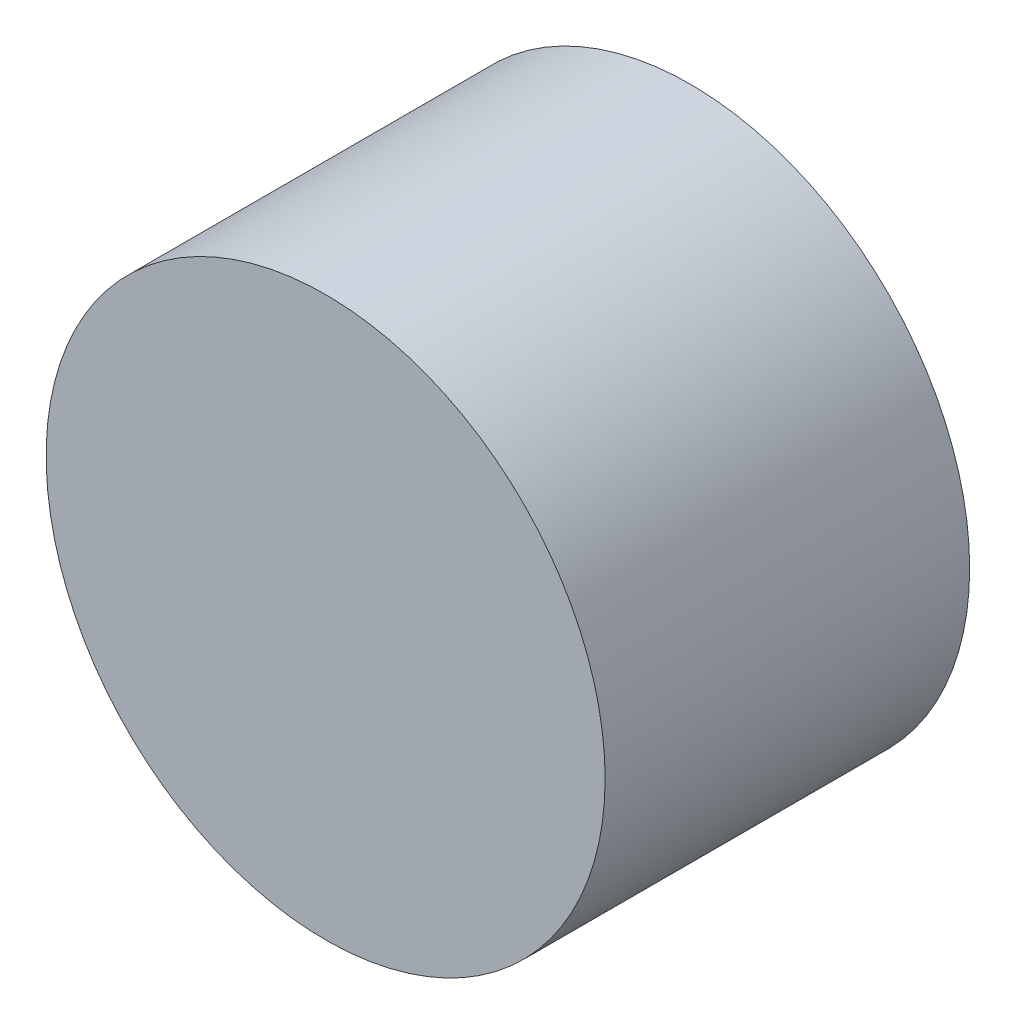
ISO-10303-21;
HEADER;
FILE_DESCRIPTION(('STEP AP214'),'2;1');
FILE_NAME('part.step','',(''),(''),'','','');
FILE_SCHEMA(('AUTOMOTIVE_DESIGN { 1 0 10303 214 1 1 1 1 }'));
ENDSEC;
DATA;
#1=APPLICATION_CONTEXT('core data for automotive mechanical design processes');
#2=APPLICATION_PROTOCOL_DEFINITION('international standard','automotive_design',2000,#1);
#3=PRODUCT_CONTEXT('',#1,'mechanical');
#4=PRODUCT('Part','Part','',(#3));
#5=PRODUCT_RELATED_PRODUCT_CATEGORY('part','',(#4));
#6=PRODUCT_DEFINITION_FORMATION('','',#4);
#7=PRODUCT_DEFINITION_CONTEXT('part definition',#1,'design');
#8=PRODUCT_DEFINITION('design','',#6,#7);
#9=PRODUCT_DEFINITION_SHAPE('','',#8);
#10=(LENGTH_UNIT() NAMED_UNIT(*) SI_UNIT(.MILLI.,.METRE.));
#11=(NAMED_UNIT(*) PLANE_ANGLE_UNIT() SI_UNIT($,.RADIAN.));
#12=(NAMED_UNIT(*) SI_UNIT($,.STERADIAN.) SOLID_ANGLE_UNIT());
#13=UNCERTAINTY_MEASURE_WITH_UNIT(LENGTH_MEASURE(1.E-05),#10,'distance_accuracy_value','');
#14=(GEOMETRIC_REPRESENTATION_CONTEXT(3) GLOBAL_UNCERTAINTY_ASSIGNED_CONTEXT((#13)) GLOBAL_UNIT_ASSIGNED_CONTEXT((#10,
#11,#12)) REPRESENTATION_CONTEXT('',''));
#15=CARTESIAN_POINT('',(0.,0.,0.));
#16=DIRECTION('',(0.,0.,1.));
#17=DIRECTION('',(1.,0.,0.));
#18=AXIS2_PLACEMENT_3D('',#15,#16,#17);
#19=CARTESIAN_POINT('',(0.,0.,15.));
#20=DIRECTION('',(0.,0.,-1.));
#21=DIRECTION('',(-1.,0.,0.));
#22=AXIS2_PLACEMENT_3D('',#19,#20,#21);
#23=CYLINDRICAL_SURFACE('',#22,11.5);
#24=CARTESIAN_POINT('',(0.,0.,15.));
#25=DIRECTION('',(0.,0.,1.));
#26=DIRECTION('',(1.,0.,0.));
#27=AXIS2_PLACEMENT_3D('',#24,#25,#26);
#28=CIRCLE('',#27,11.5);
#29=CARTESIAN_POINT('',(11.5,0.,15.));
#30=VERTEX_POINT('',#29);
#31=EDGE_CURVE('E10',#30,#30,#28,.T.);
#32=ORIENTED_EDGE('',*,*,#31,.F.);
#33=EDGE_LOOP('',(#32));
#34=FACE_BOUND('',#33,.T.);
#35=CARTESIAN_POINT('',(0.,0.,0.));
#36=DIRECTION('',(0.,0.,1.));
#37=DIRECTION('',(1.,0.,0.));
#38=AXIS2_PLACEMENT_3D('',#35,#36,#37);
#39=CIRCLE('',#38,11.5);
#40=CARTESIAN_POINT('',(11.5,0.,0.));
#41=VERTEX_POINT('',#40);
#42=EDGE_CURVE('E40',#41,#41,#39,.T.);
#43=ORIENTED_EDGE('',*,*,#42,.T.);
#44=EDGE_LOOP('',(#43));
#45=FACE_BOUND('',#44,.T.);
#46=ADVANCED_FACE('F37',(#34,#45),#23,.T.);
#47=CARTESIAN_POINT('',(0.,0.,15.));
#48=DIRECTION('',(0.,0.,1.));
#49=DIRECTION('',(1.,0.,0.));
#50=AXIS2_PLACEMENT_3D('',#47,#48,#49);
#51=PLANE('',#50);
#52=ORIENTED_EDGE('',*,*,#31,.T.);
#53=EDGE_LOOP('',(#52));
#54=FACE_BOUND('',#53,.T.);
#55=ADVANCED_FACE('F54',(#54),#51,.T.);
#56=CARTESIAN_POINT('',(0.,0.,0.));
#57=DIRECTION('',(0.,0.,1.));
#58=DIRECTION('',(1.,0.,0.));
#59=AXIS2_PLACEMENT_3D('',#56,#57,#58);
#60=PLANE('',#59);
#61=ORIENTED_EDGE('',*,*,#42,.F.);
#62=EDGE_LOOP('',(#61));
#63=FACE_BOUND('',#62,.T.);
#64=ADVANCED_FACE('F52',(#63),#60,.F.);
#65=CLOSED_SHELL('',(#46,#55,#64));
#66=MANIFOLD_SOLID_BREP('B2',#65);
#67=ADVANCED_BREP_SHAPE_REPRESENTATION('',(#18,#66),#14);
#68=SHAPE_DEFINITION_REPRESENTATION(#9,#67);
ENDSEC;
END-ISO-10303-21;
